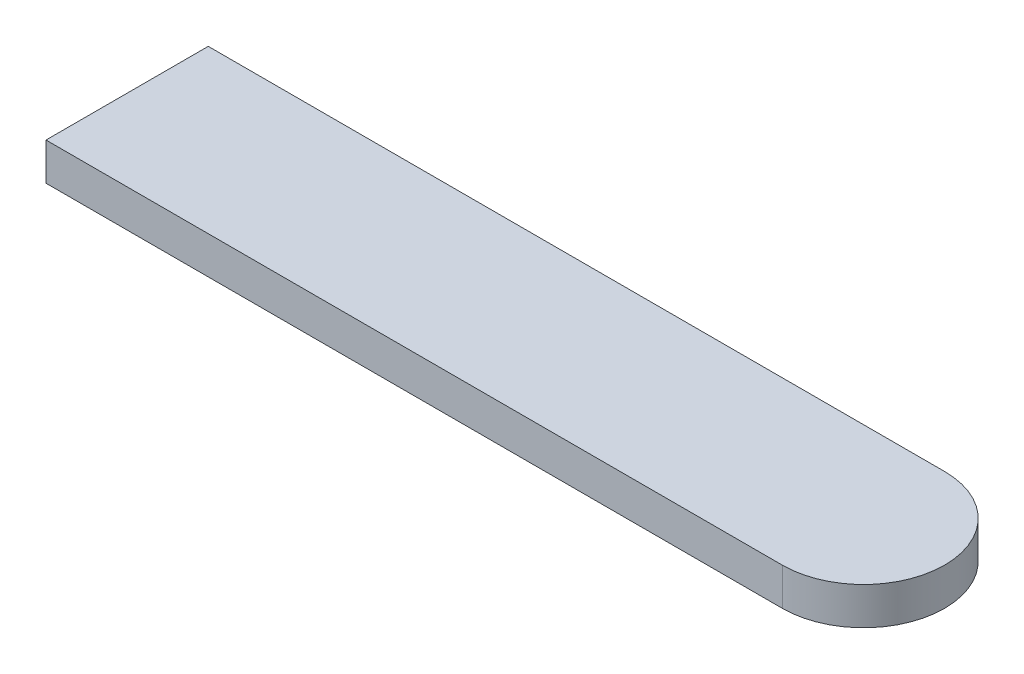
ISO-10303-21;
HEADER;
FILE_DESCRIPTION(('STEP AP214'),'2;1');
FILE_NAME('part.step','',(''),(''),'','','');
FILE_SCHEMA(('AUTOMOTIVE_DESIGN { 1 0 10303 214 1 1 1 1 }'));
ENDSEC;
DATA;
#1=APPLICATION_CONTEXT('core data for automotive mechanical design processes');
#2=APPLICATION_PROTOCOL_DEFINITION('international standard','automotive_design',2000,#1);
#3=PRODUCT_CONTEXT('',#1,'mechanical');
#4=PRODUCT('Part','Part','',(#3));
#5=PRODUCT_RELATED_PRODUCT_CATEGORY('part','',(#4));
#6=PRODUCT_DEFINITION_FORMATION('','',#4);
#7=PRODUCT_DEFINITION_CONTEXT('part definition',#1,'design');
#8=PRODUCT_DEFINITION('design','',#6,#7);
#9=PRODUCT_DEFINITION_SHAPE('','',#8);
#10=(LENGTH_UNIT() NAMED_UNIT(*) SI_UNIT(.MILLI.,.METRE.));
#11=(NAMED_UNIT(*) PLANE_ANGLE_UNIT() SI_UNIT($,.RADIAN.));
#12=(NAMED_UNIT(*) SI_UNIT($,.STERADIAN.) SOLID_ANGLE_UNIT());
#13=UNCERTAINTY_MEASURE_WITH_UNIT(LENGTH_MEASURE(1.E-05),#10,'distance_accuracy_value','');
#14=(GEOMETRIC_REPRESENTATION_CONTEXT(3) GLOBAL_UNCERTAINTY_ASSIGNED_CONTEXT((#13)) GLOBAL_UNIT_ASSIGNED_CONTEXT((#10,
#11,#12)) REPRESENTATION_CONTEXT('',''));
#15=CARTESIAN_POINT('',(0.,0.,0.));
#16=DIRECTION('',(0.,0.,1.));
#17=DIRECTION('',(1.,0.,0.));
#18=AXIS2_PLACEMENT_3D('',#15,#16,#17);
#19=CARTESIAN_POINT('',(-10.5,6.977761601016,0.));
#20=DIRECTION('',(1.,0.,0.));
#21=DIRECTION('',(0.,0.,-1.));
#22=AXIS2_PLACEMENT_3D('',#19,#20,#21);
#23=PLANE('',#22);
#24=DIRECTION('',(0.,0.,1.));
#25=VECTOR('',#24,1.);
#26=CARTESIAN_POINT('',(-10.5,0.3,0.));
#27=LINE('',#26,#25);
#28=CARTESIAN_POINT('',(-10.5,0.3,-0.650000000000001));
#29=VERTEX_POINT('',#28);
#30=CARTESIAN_POINT('',(-10.5,0.3,0.649999999999998));
#31=VERTEX_POINT('',#30);
#32=EDGE_CURVE('E11',#29,#31,#27,.T.);
#33=ORIENTED_EDGE('',*,*,#32,.F.);
#34=DIRECTION('',(0.,-1.,0.));
#35=VECTOR('',#34,1.);
#36=CARTESIAN_POINT('',(-10.5,6.977761601016,-0.650000000000001));
#37=LINE('',#36,#35);
#38=CARTESIAN_POINT('',(-10.5,0.,-0.650000000000001));
#39=VERTEX_POINT('',#38);
#40=EDGE_CURVE('E24',#29,#39,#37,.T.);
#41=ORIENTED_EDGE('',*,*,#40,.T.);
#42=DIRECTION('',(0.,0.,1.));
#43=VECTOR('',#42,1.);
#44=CARTESIAN_POINT('',(-10.5,0.,0.));
#45=LINE('',#44,#43);
#46=CARTESIAN_POINT('',(-10.5,0.,0.649999999999998));
#47=VERTEX_POINT('',#46);
#48=EDGE_CURVE('E75',#39,#47,#45,.T.);
#49=ORIENTED_EDGE('',*,*,#48,.T.);
#50=DIRECTION('',(0.,-1.,0.));
#51=VECTOR('',#50,1.);
#52=CARTESIAN_POINT('',(-10.5,6.977761601016,0.649999999999998));
#53=LINE('',#52,#51);
#54=EDGE_CURVE('E85',#31,#47,#53,.T.);
#55=ORIENTED_EDGE('',*,*,#54,.F.);
#56=EDGE_LOOP('',(#33,#41,#49,#55));
#57=FACE_BOUND('',#56,.T.);
#58=ADVANCED_FACE('F17',(#57),#23,.F.);
#59=CARTESIAN_POINT('',(-10.5,6.977761601016,0.649999999999998));
#60=DIRECTION('',(0.,0.,-1.));
#61=DIRECTION('',(-1.,0.,0.));
#62=AXIS2_PLACEMENT_3D('',#59,#60,#61);
#63=PLANE('',#62);
#64=DIRECTION('',(1.,0.,0.));
#65=VECTOR('',#64,1.);
#66=CARTESIAN_POINT('',(-10.5,0.3,0.649999999999998));
#67=LINE('',#66,#65);
#68=CARTESIAN_POINT('',(-4.6,0.3,0.649999999999998));
#69=VERTEX_POINT('',#68);
#70=EDGE_CURVE('E83',#31,#69,#67,.T.);
#71=ORIENTED_EDGE('',*,*,#70,.F.);
#72=ORIENTED_EDGE('',*,*,#54,.T.);
#73=DIRECTION('',(1.,0.,0.));
#74=VECTOR('',#73,1.);
#75=CARTESIAN_POINT('',(-10.5,0.,0.649999999999998));
#76=LINE('',#75,#74);
#77=CARTESIAN_POINT('',(-4.6,0.,0.649999999999998));
#78=VERTEX_POINT('',#77);
#79=EDGE_CURVE('E81',#47,#78,#76,.T.);
#80=ORIENTED_EDGE('',*,*,#79,.T.);
#81=DIRECTION('',(0.,-1.,0.));
#82=VECTOR('',#81,1.);
#83=CARTESIAN_POINT('',(-4.6,6.977761601016,0.649999999999998));
#84=LINE('',#83,#82);
#85=EDGE_CURVE('E61',#69,#78,#84,.T.);
#86=ORIENTED_EDGE('',*,*,#85,.F.);
#87=EDGE_LOOP('',(#71,#72,#80,#86));
#88=FACE_BOUND('',#87,.T.);
#89=ADVANCED_FACE('F91',(#88),#63,.F.);
#90=CARTESIAN_POINT('',(-4.6,6.977761601016,0.));
#91=DIRECTION('',(0.,-1.,0.));
#92=DIRECTION('',(0.,0.,-1.));
#93=AXIS2_PLACEMENT_3D('',#90,#91,#92);
#94=CYLINDRICAL_SURFACE('',#93,0.649999999999998);
#95=CARTESIAN_POINT('',(-4.6,0.3,0.));
#96=DIRECTION('',(0.,1.,0.));
#97=DIRECTION('',(0.,0.,1.));
#98=AXIS2_PLACEMENT_3D('',#95,#96,#97);
#99=CIRCLE('',#98,0.649999999999998);
#100=CARTESIAN_POINT('',(-4.6,0.3,-0.649999999999998));
#101=VERTEX_POINT('',#100);
#102=EDGE_CURVE('E65',#69,#101,#99,.T.);
#103=ORIENTED_EDGE('',*,*,#102,.F.);
#104=ORIENTED_EDGE('',*,*,#85,.T.);
#105=CARTESIAN_POINT('',(-4.6,0.,0.));
#106=DIRECTION('',(0.,1.,0.));
#107=DIRECTION('',(0.,0.,1.));
#108=AXIS2_PLACEMENT_3D('',#105,#106,#107);
#109=CIRCLE('',#108,0.649999999999998);
#110=CARTESIAN_POINT('',(-4.6,0.,-0.649999999999998));
#111=VERTEX_POINT('',#110);
#112=EDGE_CURVE('E54',#78,#111,#109,.T.);
#113=ORIENTED_EDGE('',*,*,#112,.T.);
#114=DIRECTION('',(0.,-1.,0.));
#115=VECTOR('',#114,1.);
#116=CARTESIAN_POINT('',(-4.6,6.977761601016,-0.649999999999998));
#117=LINE('',#116,#115);
#118=EDGE_CURVE('E58',#101,#111,#117,.T.);
#119=ORIENTED_EDGE('',*,*,#118,.F.);
#120=EDGE_LOOP('',(#103,#104,#113,#119));
#121=FACE_BOUND('',#120,.T.);
#122=ADVANCED_FACE('F57',(#121),#94,.T.);
#123=CARTESIAN_POINT('',(-4.6,6.977761601016,-0.649999999999999));
#124=DIRECTION('',(0.,0.,1.));
#125=DIRECTION('',(1.,0.,0.));
#126=AXIS2_PLACEMENT_3D('',#123,#124,#125);
#127=PLANE('',#126);
#128=DIRECTION('',(-1.,0.,0.));
#129=VECTOR('',#128,1.);
#130=CARTESIAN_POINT('',(-4.6,0.3,-0.649999999999999));
#131=LINE('',#130,#129);
#132=EDGE_CURVE('E71',#101,#29,#131,.T.);
#133=ORIENTED_EDGE('',*,*,#132,.F.);
#134=ORIENTED_EDGE('',*,*,#118,.T.);
#135=DIRECTION('',(-1.,0.,0.));
#136=VECTOR('',#135,1.);
#137=CARTESIAN_POINT('',(-4.6,0.,-0.649999999999999));
#138=LINE('',#137,#136);
#139=EDGE_CURVE('E70',#111,#39,#138,.T.);
#140=ORIENTED_EDGE('',*,*,#139,.T.);
#141=ORIENTED_EDGE('',*,*,#40,.F.);
#142=EDGE_LOOP('',(#133,#134,#140,#141));
#143=FACE_BOUND('',#142,.T.);
#144=ADVANCED_FACE('F69',(#143),#127,.F.);
#145=CARTESIAN_POINT('',(-4.6,0.,0.));
#146=DIRECTION('',(0.,1.,0.));
#147=DIRECTION('',(0.,0.,1.));
#148=AXIS2_PLACEMENT_3D('',#145,#146,#147);
#149=PLANE('',#148);
#150=ORIENTED_EDGE('',*,*,#48,.F.);
#151=ORIENTED_EDGE('',*,*,#139,.F.);
#152=ORIENTED_EDGE('',*,*,#112,.F.);
#153=ORIENTED_EDGE('',*,*,#79,.F.);
#154=EDGE_LOOP('',(#150,#151,#152,#153));
#155=FACE_BOUND('',#154,.T.);
#156=ADVANCED_FACE('F74',(#155),#149,.F.);
#157=CARTESIAN_POINT('',(0.,0.3,0.));
#158=DIRECTION('',(0.,1.,0.));
#159=DIRECTION('',(0.,0.,1.));
#160=AXIS2_PLACEMENT_3D('',#157,#158,#159);
#161=PLANE('',#160);
#162=ORIENTED_EDGE('',*,*,#132,.T.);
#163=ORIENTED_EDGE('',*,*,#32,.T.);
#164=ORIENTED_EDGE('',*,*,#70,.T.);
#165=ORIENTED_EDGE('',*,*,#102,.T.);
#166=EDGE_LOOP('',(#162,#163,#164,#165));
#167=FACE_BOUND('',#166,.T.);
#168=ADVANCED_FACE('F88',(#167),#161,.T.);
#169=CLOSED_SHELL('',(#58,#89,#122,#144,#156,#168));
#170=MANIFOLD_SOLID_BREP('B1',#169);
#171=ADVANCED_BREP_SHAPE_REPRESENTATION('',(#18,#170),#14);
#172=SHAPE_DEFINITION_REPRESENTATION(#9,#171);
ENDSEC;
END-ISO-10303-21;
